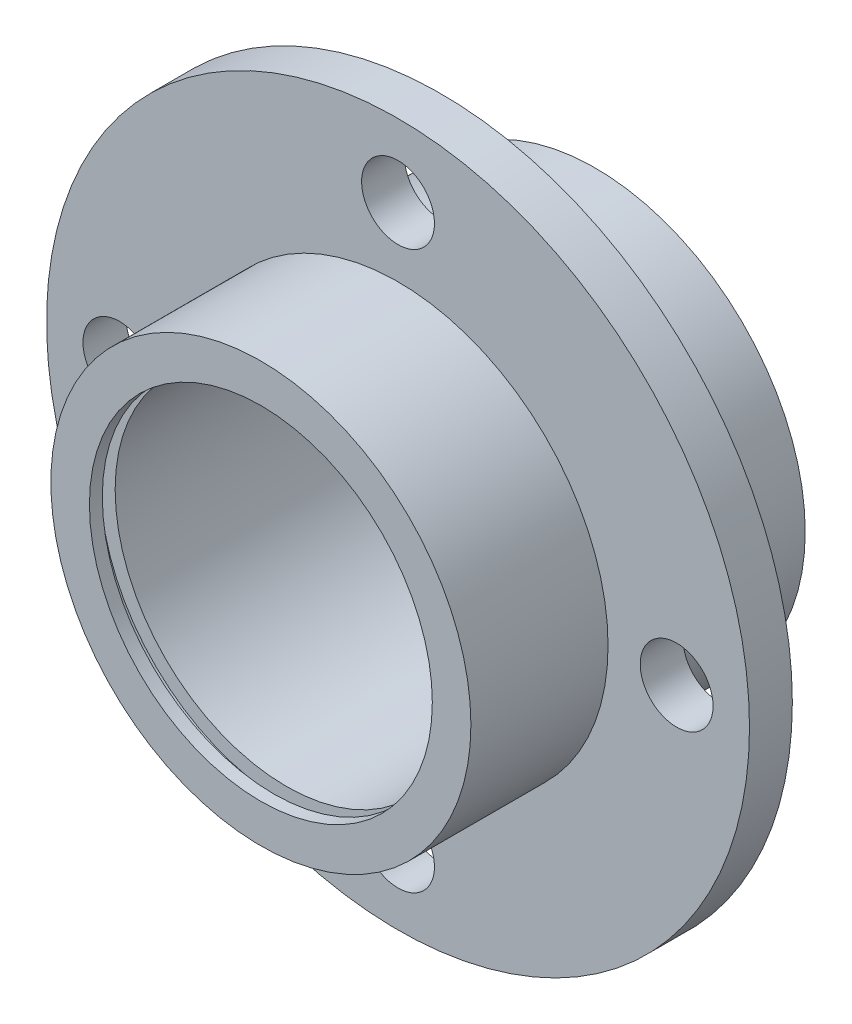
ISO-10303-21;
HEADER;
FILE_DESCRIPTION(('STEP AP214'),'2;1');
FILE_NAME('part.step','',(''),(''),'','','');
FILE_SCHEMA(('AUTOMOTIVE_DESIGN { 1 0 10303 214 1 1 1 1 }'));
ENDSEC;
DATA;
#1=APPLICATION_CONTEXT('core data for automotive mechanical design processes');
#2=APPLICATION_PROTOCOL_DEFINITION('international standard','automotive_design',2000,#1);
#3=PRODUCT_CONTEXT('',#1,'mechanical');
#4=PRODUCT('Part','Part','',(#3));
#5=PRODUCT_RELATED_PRODUCT_CATEGORY('part','',(#4));
#6=PRODUCT_DEFINITION_FORMATION('','',#4);
#7=PRODUCT_DEFINITION_CONTEXT('part definition',#1,'design');
#8=PRODUCT_DEFINITION('design','',#6,#7);
#9=PRODUCT_DEFINITION_SHAPE('','',#8);
#10=(LENGTH_UNIT() NAMED_UNIT(*) SI_UNIT(.MILLI.,.METRE.));
#11=(NAMED_UNIT(*) PLANE_ANGLE_UNIT() SI_UNIT($,.RADIAN.));
#12=(NAMED_UNIT(*) SI_UNIT($,.STERADIAN.) SOLID_ANGLE_UNIT());
#13=UNCERTAINTY_MEASURE_WITH_UNIT(LENGTH_MEASURE(1.E-05),#10,'distance_accuracy_value','');
#14=(GEOMETRIC_REPRESENTATION_CONTEXT(3) GLOBAL_UNCERTAINTY_ASSIGNED_CONTEXT((#13)) GLOBAL_UNIT_ASSIGNED_CONTEXT((#10,
#11,#12)) REPRESENTATION_CONTEXT('',''));
#15=CARTESIAN_POINT('',(0.,0.,0.));
#16=DIRECTION('',(0.,0.,1.));
#17=DIRECTION('',(1.,0.,0.));
#18=AXIS2_PLACEMENT_3D('',#15,#16,#17);
#19=CARTESIAN_POINT('',(0.,0.,39.));
#20=DIRECTION('',(0.,0.,-1.));
#21=DIRECTION('',(-1.,0.,0.));
#22=AXIS2_PLACEMENT_3D('',#19,#20,#21);
#23=CYLINDRICAL_SURFACE('',#22,24.5);
#24=CARTESIAN_POINT('',(0.,0.,0.));
#25=DIRECTION('',(0.,0.,1.));
#26=DIRECTION('',(1.,0.,0.));
#27=AXIS2_PLACEMENT_3D('',#24,#25,#26);
#28=CIRCLE('',#27,24.5);
#29=CARTESIAN_POINT('',(24.5,0.,0.));
#30=VERTEX_POINT('',#29);
#31=EDGE_CURVE('E48',#30,#30,#28,.T.);
#32=ORIENTED_EDGE('',*,*,#31,.T.);
#33=EDGE_LOOP('',(#32));
#34=FACE_BOUND('',#33,.T.);
#35=CARTESIAN_POINT('',(0.,0.,18.));
#36=DIRECTION('',(0.,0.,1.));
#37=DIRECTION('',(1.,0.,0.));
#38=AXIS2_PLACEMENT_3D('',#35,#36,#37);
#39=CIRCLE('',#38,24.5);
#40=CARTESIAN_POINT('',(24.5,0.,18.));
#41=VERTEX_POINT('',#40);
#42=EDGE_CURVE('E10',#41,#41,#39,.T.);
#43=ORIENTED_EDGE('',*,*,#42,.F.);
#44=EDGE_LOOP('',(#43));
#45=FACE_BOUND('',#44,.T.);
#46=ADVANCED_FACE('F37',(#34,#45),#23,.T.);
#47=CARTESIAN_POINT('',(0.,0.,3.));
#48=DIRECTION('',(0.,0.,1.));
#49=DIRECTION('',(1.,0.,0.));
#50=AXIS2_PLACEMENT_3D('',#47,#48,#49);
#51=CYLINDRICAL_SURFACE('',#50,20.);
#52=CARTESIAN_POINT('',(0.,0.,3.));
#53=DIRECTION('',(0.,0.,1.));
#54=DIRECTION('',(1.,0.,0.));
#55=AXIS2_PLACEMENT_3D('',#52,#53,#54);
#56=CIRCLE('',#55,20.);
#57=CARTESIAN_POINT('',(20.,0.,3.));
#58=VERTEX_POINT('',#57);
#59=EDGE_CURVE('E53',#58,#58,#56,.T.);
#60=ORIENTED_EDGE('',*,*,#59,.F.);
#61=EDGE_LOOP('',(#60));
#62=FACE_BOUND('',#61,.T.);
#63=CARTESIAN_POINT('',(0.,0.,36.));
#64=DIRECTION('',(0.,0.,1.));
#65=DIRECTION('',(1.,0.,0.));
#66=AXIS2_PLACEMENT_3D('',#63,#64,#65);
#67=CIRCLE('',#66,20.);
#68=CARTESIAN_POINT('',(20.,0.,36.));
#69=VERTEX_POINT('',#68);
#70=EDGE_CURVE('E59',#69,#69,#67,.F.);
#71=ORIENTED_EDGE('',*,*,#70,.F.);
#72=EDGE_LOOP('',(#71));
#73=FACE_BOUND('',#72,.T.);
#74=ADVANCED_FACE('F92',(#62,#73),#51,.F.);
#75=CARTESIAN_POINT('',(0.,0.,23.));
#76=DIRECTION('',(0.,0.,1.));
#77=DIRECTION('',(1.,0.,0.));
#78=AXIS2_PLACEMENT_3D('',#75,#76,#77);
#79=CIRCLE('',#78,24.5);
#80=CARTESIAN_POINT('',(24.5,0.,23.));
#81=VERTEX_POINT('',#80);
#82=EDGE_CURVE('E182',#81,#81,#79,.T.);
#83=ORIENTED_EDGE('',*,*,#82,.T.);
#84=EDGE_LOOP('',(#83));
#85=FACE_BOUND('',#84,.T.);
#86=CARTESIAN_POINT('',(0.,0.,39.));
#87=DIRECTION('',(0.,0.,1.));
#88=DIRECTION('',(1.,0.,0.));
#89=AXIS2_PLACEMENT_3D('',#86,#87,#88);
#90=CIRCLE('',#89,24.5);
#91=CARTESIAN_POINT('',(24.5,0.,39.));
#92=VERTEX_POINT('',#91);
#93=EDGE_CURVE('E44',#92,#92,#90,.T.);
#94=ORIENTED_EDGE('',*,*,#93,.F.);
#95=EDGE_LOOP('',(#94));
#96=FACE_BOUND('',#95,.T.);
#97=ADVANCED_FACE('F39',(#85,#96),#23,.T.);
#98=CARTESIAN_POINT('',(0.,0.,39.));
#99=DIRECTION('',(0.,0.,1.));
#100=DIRECTION('',(1.,0.,0.));
#101=AXIS2_PLACEMENT_3D('',#98,#99,#100);
#102=PLANE('',#101);
#103=CARTESIAN_POINT('',(0.,0.,39.));
#104=DIRECTION('',(0.,0.,1.));
#105=DIRECTION('',(1.,0.,0.));
#106=AXIS2_PLACEMENT_3D('',#103,#104,#105);
#107=CIRCLE('',#106,20.);
#108=CARTESIAN_POINT('',(20.,0.,39.));
#109=VERTEX_POINT('',#108);
#110=EDGE_CURVE('E56',#109,#109,#107,.T.);
#111=ORIENTED_EDGE('',*,*,#110,.F.);
#112=EDGE_LOOP('',(#111));
#113=FACE_BOUND('',#112,.T.);
#114=ORIENTED_EDGE('',*,*,#93,.T.);
#115=EDGE_LOOP('',(#114));
#116=FACE_BOUND('',#115,.T.);
#117=ADVANCED_FACE('F83',(#113,#116),#102,.T.);
#118=CARTESIAN_POINT('',(0.,0.,0.));
#119=DIRECTION('',(0.,0.,1.));
#120=DIRECTION('',(1.,0.,0.));
#121=AXIS2_PLACEMENT_3D('',#118,#119,#120);
#122=PLANE('',#121);
#123=CARTESIAN_POINT('',(0.,0.,0.));
#124=DIRECTION('',(0.,0.,1.));
#125=DIRECTION('',(1.,0.,0.));
#126=AXIS2_PLACEMENT_3D('',#123,#124,#125);
#127=CIRCLE('',#126,15.);
#128=CARTESIAN_POINT('',(15.,0.,0.));
#129=VERTEX_POINT('',#128);
#130=EDGE_CURVE('E68',#129,#129,#127,.T.);
#131=ORIENTED_EDGE('',*,*,#130,.T.);
#132=EDGE_LOOP('',(#131));
#133=FACE_BOUND('',#132,.T.);
#134=ORIENTED_EDGE('',*,*,#31,.F.);
#135=EDGE_LOOP('',(#134));
#136=FACE_BOUND('',#135,.T.);
#137=ADVANCED_FACE('F85',(#133,#136),#122,.F.);
#138=CARTESIAN_POINT('',(0.,0.,37.5));
#139=DIRECTION('',(0.,0.,1.));
#140=DIRECTION('',(1.,0.,0.));
#141=AXIS2_PLACEMENT_3D('',#138,#139,#140);
#142=CIRCLE('',#141,20.);
#143=CARTESIAN_POINT('',(20.,0.,37.5));
#144=VERTEX_POINT('',#143);
#145=EDGE_CURVE('E61',#144,#144,#142,.F.);
#146=ORIENTED_EDGE('',*,*,#145,.T.);
#147=EDGE_LOOP('',(#146));
#148=FACE_BOUND('',#147,.T.);
#149=ORIENTED_EDGE('',*,*,#110,.T.);
#150=EDGE_LOOP('',(#149));
#151=FACE_BOUND('',#150,.T.);
#152=ADVANCED_FACE('F81',(#148,#151),#51,.F.);
#153=CARTESIAN_POINT('',(0.,0.,3.));
#154=DIRECTION('',(0.,0.,1.));
#155=DIRECTION('',(1.,0.,0.));
#156=AXIS2_PLACEMENT_3D('',#153,#154,#155);
#157=PLANE('',#156);
#158=CARTESIAN_POINT('',(0.,0.,3.));
#159=DIRECTION('',(0.,0.,1.));
#160=DIRECTION('',(1.,0.,0.));
#161=AXIS2_PLACEMENT_3D('',#158,#159,#160);
#162=CIRCLE('',#161,15.);
#163=CARTESIAN_POINT('',(15.,0.,3.));
#164=VERTEX_POINT('',#163);
#165=EDGE_CURVE('E64',#164,#164,#162,.T.);
#166=ORIENTED_EDGE('',*,*,#165,.F.);
#167=EDGE_LOOP('',(#166));
#168=FACE_BOUND('',#167,.T.);
#169=ORIENTED_EDGE('',*,*,#59,.T.);
#170=EDGE_LOOP('',(#169));
#171=FACE_BOUND('',#170,.T.);
#172=ADVANCED_FACE('F111',(#168,#171),#157,.T.);
#173=CARTESIAN_POINT('',(0.,0.,0.));
#174=DIRECTION('',(0.,0.,1.));
#175=DIRECTION('',(1.,0.,0.));
#176=AXIS2_PLACEMENT_3D('',#173,#174,#175);
#177=CYLINDRICAL_SURFACE('',#176,15.);
#178=ORIENTED_EDGE('',*,*,#130,.F.);
#179=EDGE_LOOP('',(#178));
#180=FACE_BOUND('',#179,.T.);
#181=ORIENTED_EDGE('',*,*,#165,.T.);
#182=EDGE_LOOP('',(#181));
#183=FACE_BOUND('',#182,.T.);
#184=ADVANCED_FACE('F116',(#180,#183),#177,.F.);
#185=CARTESIAN_POINT('',(0.,0.,37.5));
#186=DIRECTION('',(0.,0.,1.));
#187=DIRECTION('',(1.,0.,0.));
#188=AXIS2_PLACEMENT_3D('',#185,#186,#187);
#189=PLANE('',#188);
#190=CARTESIAN_POINT('',(0.,0.,37.5));
#191=DIRECTION('',(0.,0.,1.));
#192=DIRECTION('',(1.,0.,0.));
#193=AXIS2_PLACEMENT_3D('',#190,#191,#192);
#194=CIRCLE('',#193,21.75);
#195=CARTESIAN_POINT('',(21.75,0.,37.5));
#196=VERTEX_POINT('',#195);
#197=EDGE_CURVE('E62',#196,#196,#194,.T.);
#198=ORIENTED_EDGE('',*,*,#197,.F.);
#199=EDGE_LOOP('',(#198));
#200=FACE_BOUND('',#199,.T.);
#201=ORIENTED_EDGE('',*,*,#145,.F.);
#202=EDGE_LOOP('',(#201));
#203=FACE_BOUND('',#202,.T.);
#204=ADVANCED_FACE('F120',(#200,#203),#189,.F.);
#205=CARTESIAN_POINT('',(0.,0.,36.));
#206=DIRECTION('',(0.,0.,1.));
#207=DIRECTION('',(1.,0.,0.));
#208=AXIS2_PLACEMENT_3D('',#205,#206,#207);
#209=PLANE('',#208);
#210=CARTESIAN_POINT('',(0.,0.,36.));
#211=DIRECTION('',(0.,0.,1.));
#212=DIRECTION('',(1.,0.,0.));
#213=AXIS2_PLACEMENT_3D('',#210,#211,#212);
#214=CIRCLE('',#213,21.75);
#215=CARTESIAN_POINT('',(21.75,0.,36.));
#216=VERTEX_POINT('',#215);
#217=EDGE_CURVE('E189',#216,#216,#214,.T.);
#218=ORIENTED_EDGE('',*,*,#217,.T.);
#219=EDGE_LOOP('',(#218));
#220=FACE_BOUND('',#219,.T.);
#221=ORIENTED_EDGE('',*,*,#70,.T.);
#222=EDGE_LOOP('',(#221));
#223=FACE_BOUND('',#222,.T.);
#224=ADVANCED_FACE('F127',(#220,#223),#209,.T.);
#225=CARTESIAN_POINT('',(0.,0.,37.5));
#226=DIRECTION('',(0.,0.,-1.));
#227=DIRECTION('',(-1.,0.,0.));
#228=AXIS2_PLACEMENT_3D('',#225,#226,#227);
#229=CYLINDRICAL_SURFACE('',#228,21.75);
#230=ORIENTED_EDGE('',*,*,#197,.T.);
#231=EDGE_LOOP('',(#230));
#232=FACE_BOUND('',#231,.T.);
#233=ORIENTED_EDGE('',*,*,#217,.F.);
#234=EDGE_LOOP('',(#233));
#235=FACE_BOUND('',#234,.T.);
#236=ADVANCED_FACE('F124',(#232,#235),#229,.F.);
#237=CARTESIAN_POINT('',(0.,0.,18.));
#238=DIRECTION('',(0.,0.,1.));
#239=DIRECTION('',(1.,0.,0.));
#240=AXIS2_PLACEMENT_3D('',#237,#238,#239);
#241=CYLINDRICAL_SURFACE('',#240,41.);
#242=CARTESIAN_POINT('',(0.,0.,18.));
#243=DIRECTION('',(0.,0.,1.));
#244=DIRECTION('',(1.,0.,0.));
#245=AXIS2_PLACEMENT_3D('',#242,#243,#244);
#246=CIRCLE('',#245,41.);
#247=CARTESIAN_POINT('',(41.,0.,18.));
#248=VERTEX_POINT('',#247);
#249=EDGE_CURVE('E186',#248,#248,#246,.T.);
#250=ORIENTED_EDGE('',*,*,#249,.T.);
#251=EDGE_LOOP('',(#250));
#252=FACE_BOUND('',#251,.T.);
#253=CARTESIAN_POINT('',(0.,0.,23.));
#254=DIRECTION('',(0.,0.,1.));
#255=DIRECTION('',(1.,0.,0.));
#256=AXIS2_PLACEMENT_3D('',#253,#254,#255);
#257=CIRCLE('',#256,41.);
#258=CARTESIAN_POINT('',(41.,0.,23.));
#259=VERTEX_POINT('',#258);
#260=EDGE_CURVE('E185',#259,#259,#257,.T.);
#261=ORIENTED_EDGE('',*,*,#260,.F.);
#262=EDGE_LOOP('',(#261));
#263=FACE_BOUND('',#262,.T.);
#264=ADVANCED_FACE('F126',(#252,#263),#241,.T.);
#265=CARTESIAN_POINT('',(0.,0.,18.));
#266=DIRECTION('',(0.,0.,1.));
#267=DIRECTION('',(1.,0.,0.));
#268=AXIS2_PLACEMENT_3D('',#265,#266,#267);
#269=PLANE('',#268);
#270=CARTESIAN_POINT('',(-1.13473143512402E-13,32.5,18.));
#271=DIRECTION('',(0.,0.,1.));
#272=DIRECTION('',(1.,0.,0.));
#273=AXIS2_PLACEMENT_3D('',#270,#271,#272);
#274=CIRCLE('',#273,4.25);
#275=CARTESIAN_POINT('',(4.24999999999988,32.5,18.));
#276=VERTEX_POINT('',#275);
#277=EDGE_CURVE('E168',#276,#276,#274,.T.);
#278=ORIENTED_EDGE('',*,*,#277,.T.);
#279=EDGE_LOOP('',(#278));
#280=FACE_BOUND('',#279,.T.);
#281=CARTESIAN_POINT('',(-32.5,0.,18.));
#282=DIRECTION('',(0.,0.,1.));
#283=DIRECTION('',(1.,0.,0.));
#284=AXIS2_PLACEMENT_3D('',#281,#282,#283);
#285=CIRCLE('',#284,4.25);
#286=CARTESIAN_POINT('',(-28.25,0.,18.));
#287=VERTEX_POINT('',#286);
#288=EDGE_CURVE('E170',#287,#287,#285,.T.);
#289=ORIENTED_EDGE('',*,*,#288,.T.);
#290=EDGE_LOOP('',(#289));
#291=FACE_BOUND('',#290,.T.);
#292=CARTESIAN_POINT('',(3.40419430537206E-13,-32.5,18.));
#293=DIRECTION('',(0.,0.,1.));
#294=DIRECTION('',(1.,0.,0.));
#295=AXIS2_PLACEMENT_3D('',#292,#293,#294);
#296=CIRCLE('',#295,4.25);
#297=CARTESIAN_POINT('',(4.25000000000034,-32.5,18.));
#298=VERTEX_POINT('',#297);
#299=EDGE_CURVE('E176',#298,#298,#296,.T.);
#300=ORIENTED_EDGE('',*,*,#299,.T.);
#301=EDGE_LOOP('',(#300));
#302=FACE_BOUND('',#301,.T.);
#303=CARTESIAN_POINT('',(32.5,0.,18.));
#304=DIRECTION('',(0.,0.,1.));
#305=DIRECTION('',(1.,0.,0.));
#306=AXIS2_PLACEMENT_3D('',#303,#304,#305);
#307=CIRCLE('',#306,4.25);
#308=CARTESIAN_POINT('',(36.75,0.,18.));
#309=VERTEX_POINT('',#308);
#310=EDGE_CURVE('E173',#309,#309,#307,.T.);
#311=ORIENTED_EDGE('',*,*,#310,.T.);
#312=EDGE_LOOP('',(#311));
#313=FACE_BOUND('',#312,.T.);
#314=ORIENTED_EDGE('',*,*,#42,.T.);
#315=EDGE_LOOP('',(#314));
#316=FACE_BOUND('',#315,.T.);
#317=ORIENTED_EDGE('',*,*,#249,.F.);
#318=EDGE_LOOP('',(#317));
#319=FACE_BOUND('',#318,.T.);
#320=ADVANCED_FACE('F136',(#280,#291,#302,#313,#316,#319),#269,.F.);
#321=CARTESIAN_POINT('',(0.,0.,23.));
#322=DIRECTION('',(0.,0.,1.));
#323=DIRECTION('',(1.,0.,0.));
#324=AXIS2_PLACEMENT_3D('',#321,#322,#323);
#325=PLANE('',#324);
#326=CARTESIAN_POINT('',(-1.13473143512402E-13,32.5,23.));
#327=DIRECTION('',(0.,0.,1.));
#328=DIRECTION('',(0.,1.,0.));
#329=AXIS2_PLACEMENT_3D('',#326,#327,#328);
#330=CIRCLE('',#329,4.25);
#331=CARTESIAN_POINT('',(-1.28311939202485E-13,36.75,23.));
#332=VERTEX_POINT('',#331);
#333=EDGE_CURVE('E165',#332,#332,#330,.T.);
#334=ORIENTED_EDGE('',*,*,#333,.F.);
#335=EDGE_LOOP('',(#334));
#336=FACE_BOUND('',#335,.T.);
#337=CARTESIAN_POINT('',(-32.5,0.,23.));
#338=DIRECTION('',(0.,0.,1.));
#339=DIRECTION('',(-1.,0.,0.));
#340=AXIS2_PLACEMENT_3D('',#337,#338,#339);
#341=CIRCLE('',#340,4.25);
#342=CARTESIAN_POINT('',(-36.75,0.,23.));
#343=VERTEX_POINT('',#342);
#344=EDGE_CURVE('E216',#343,#343,#341,.T.);
#345=ORIENTED_EDGE('',*,*,#344,.F.);
#346=EDGE_LOOP('',(#345));
#347=FACE_BOUND('',#346,.T.);
#348=CARTESIAN_POINT('',(3.40419430537206E-13,-32.5,23.));
#349=DIRECTION('',(0.,0.,1.));
#350=DIRECTION('',(0.,-1.,0.));
#351=AXIS2_PLACEMENT_3D('',#348,#349,#350);
#352=CIRCLE('',#351,4.25);
#353=CARTESIAN_POINT('',(3.84935817607455E-13,-36.75,23.));
#354=VERTEX_POINT('',#353);
#355=EDGE_CURVE('E213',#354,#354,#352,.T.);
#356=ORIENTED_EDGE('',*,*,#355,.F.);
#357=EDGE_LOOP('',(#356));
#358=FACE_BOUND('',#357,.T.);
#359=CARTESIAN_POINT('',(32.5,0.,23.));
#360=DIRECTION('',(0.,0.,1.));
#361=DIRECTION('',(1.,0.,0.));
#362=AXIS2_PLACEMENT_3D('',#359,#360,#361);
#363=CIRCLE('',#362,4.25);
#364=CARTESIAN_POINT('',(36.75,0.,23.));
#365=VERTEX_POINT('',#364);
#366=EDGE_CURVE('E169',#365,#365,#363,.T.);
#367=ORIENTED_EDGE('',*,*,#366,.F.);
#368=EDGE_LOOP('',(#367));
#369=FACE_BOUND('',#368,.T.);
#370=ORIENTED_EDGE('',*,*,#82,.F.);
#371=EDGE_LOOP('',(#370));
#372=FACE_BOUND('',#371,.T.);
#373=ORIENTED_EDGE('',*,*,#260,.T.);
#374=EDGE_LOOP('',(#373));
#375=FACE_BOUND('',#374,.T.);
#376=ADVANCED_FACE('F138',(#336,#347,#358,#369,#372,#375),#325,.T.);
#377=CARTESIAN_POINT('',(32.5,0.,0.));
#378=DIRECTION('',(0.,0.,1.));
#379=DIRECTION('',(1.,0.,0.));
#380=AXIS2_PLACEMENT_3D('',#377,#378,#379);
#381=CYLINDRICAL_SURFACE('',#380,4.25);
#382=ORIENTED_EDGE('',*,*,#366,.T.);
#383=EDGE_LOOP('',(#382));
#384=FACE_BOUND('',#383,.T.);
#385=ORIENTED_EDGE('',*,*,#310,.F.);
#386=EDGE_LOOP('',(#385));
#387=FACE_BOUND('',#386,.T.);
#388=ADVANCED_FACE('F141',(#384,#387),#381,.F.);
#389=CARTESIAN_POINT('',(3.40419430537206E-13,-32.5,0.));
#390=DIRECTION('',(0.,0.,1.));
#391=DIRECTION('',(1.,0.,0.));
#392=AXIS2_PLACEMENT_3D('',#389,#390,#391);
#393=CYLINDRICAL_SURFACE('',#392,4.25);
#394=ORIENTED_EDGE('',*,*,#355,.T.);
#395=EDGE_LOOP('',(#394));
#396=FACE_BOUND('',#395,.T.);
#397=ORIENTED_EDGE('',*,*,#299,.F.);
#398=EDGE_LOOP('',(#397));
#399=FACE_BOUND('',#398,.T.);
#400=ADVANCED_FACE('F148',(#396,#399),#393,.F.);
#401=CARTESIAN_POINT('',(-32.5,0.,0.));
#402=DIRECTION('',(0.,0.,1.));
#403=DIRECTION('',(1.,0.,0.));
#404=AXIS2_PLACEMENT_3D('',#401,#402,#403);
#405=CYLINDRICAL_SURFACE('',#404,4.25);
#406=ORIENTED_EDGE('',*,*,#344,.T.);
#407=EDGE_LOOP('',(#406));
#408=FACE_BOUND('',#407,.T.);
#409=ORIENTED_EDGE('',*,*,#288,.F.);
#410=EDGE_LOOP('',(#409));
#411=FACE_BOUND('',#410,.T.);
#412=ADVANCED_FACE('F152',(#408,#411),#405,.F.);
#413=CARTESIAN_POINT('',(-1.13473143512402E-13,32.5,0.));
#414=DIRECTION('',(0.,0.,1.));
#415=DIRECTION('',(1.,0.,0.));
#416=AXIS2_PLACEMENT_3D('',#413,#414,#415);
#417=CYLINDRICAL_SURFACE('',#416,4.25);
#418=ORIENTED_EDGE('',*,*,#333,.T.);
#419=EDGE_LOOP('',(#418));
#420=FACE_BOUND('',#419,.T.);
#421=ORIENTED_EDGE('',*,*,#277,.F.);
#422=EDGE_LOOP('',(#421));
#423=FACE_BOUND('',#422,.T.);
#424=ADVANCED_FACE('F156',(#420,#423),#417,.F.);
#425=CLOSED_SHELL('',(#46,#74,#97,#117,#137,#152,#172,#184,#204,#224,#236,#264,#320,#376,#388,
#400,#412,#424));
#426=MANIFOLD_SOLID_BREP('B2',#425);
#427=ADVANCED_BREP_SHAPE_REPRESENTATION('',(#18,#426),#14);
#428=SHAPE_DEFINITION_REPRESENTATION(#9,#427);
ENDSEC;
END-ISO-10303-21;
